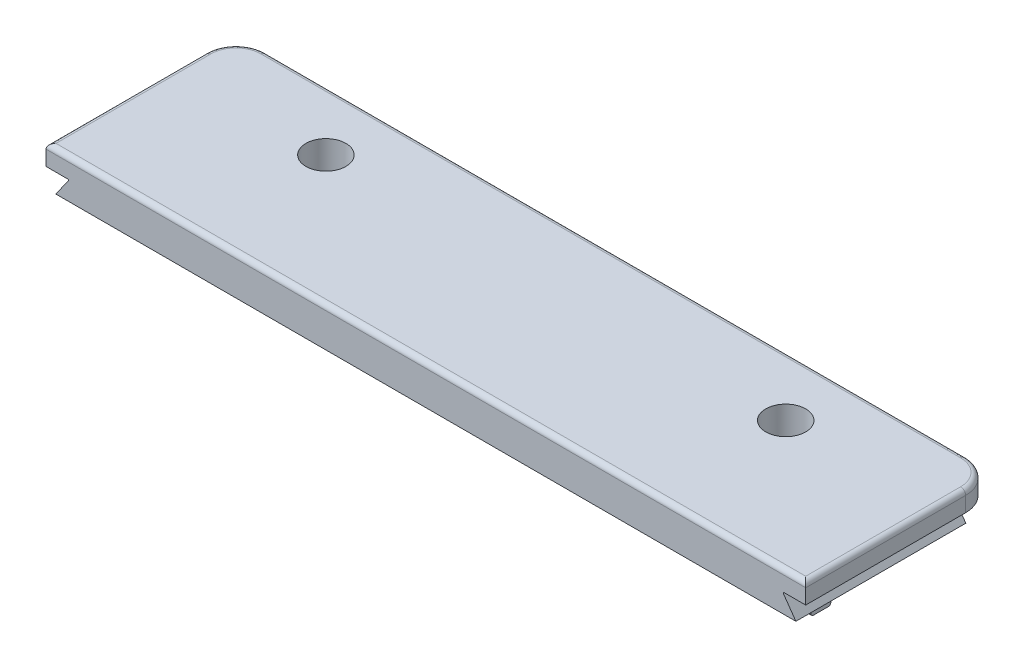
ISO-10303-21;
HEADER;
FILE_DESCRIPTION(('STEP AP214'),'2;1');
FILE_NAME('part.step','',(''),(''),'','','');
FILE_SCHEMA(('AUTOMOTIVE_DESIGN { 1 0 10303 214 1 1 1 1 }'));
ENDSEC;
DATA;
#1=APPLICATION_CONTEXT('core data for automotive mechanical design processes');
#2=APPLICATION_PROTOCOL_DEFINITION('international standard','automotive_design',2000,#1);
#3=PRODUCT_CONTEXT('',#1,'mechanical');
#4=PRODUCT('Part','Part','',(#3));
#5=PRODUCT_RELATED_PRODUCT_CATEGORY('part','',(#4));
#6=PRODUCT_DEFINITION_FORMATION('','',#4);
#7=PRODUCT_DEFINITION_CONTEXT('part definition',#1,'design');
#8=PRODUCT_DEFINITION('design','',#6,#7);
#9=PRODUCT_DEFINITION_SHAPE('','',#8);
#10=(LENGTH_UNIT() NAMED_UNIT(*) SI_UNIT(.MILLI.,.METRE.));
#11=(NAMED_UNIT(*) PLANE_ANGLE_UNIT() SI_UNIT($,.RADIAN.));
#12=(NAMED_UNIT(*) SI_UNIT($,.STERADIAN.) SOLID_ANGLE_UNIT());
#13=UNCERTAINTY_MEASURE_WITH_UNIT(LENGTH_MEASURE(1.E-05),#10,'distance_accuracy_value','');
#14=(GEOMETRIC_REPRESENTATION_CONTEXT(3) GLOBAL_UNCERTAINTY_ASSIGNED_CONTEXT((#13)) GLOBAL_UNIT_ASSIGNED_CONTEXT((#10,
#11,#12)) REPRESENTATION_CONTEXT('',''));
#15=CARTESIAN_POINT('',(0.,0.,0.));
#16=DIRECTION('',(0.,0.,1.));
#17=DIRECTION('',(1.,0.,0.));
#18=AXIS2_PLACEMENT_3D('',#15,#16,#17);
#19=CARTESIAN_POINT('',(37.0162186510252,22.2,-93.1));
#20=DIRECTION('',(0.,1.,0.));
#21=DIRECTION('',(-1.,0.,0.));
#22=AXIS2_PLACEMENT_3D('',#19,#20,#21);
#23=PLANE('',#22);
#24=CARTESIAN_POINT('',(23.,22.2,-13.));
#25=DIRECTION('',(0.,1.,0.));
#26=DIRECTION('',(-1.,0.,0.));
#27=AXIS2_PLACEMENT_3D('',#24,#25,#26);
#28=CIRCLE('',#27,2.);
#29=CARTESIAN_POINT('',(21.,22.2,-13.));
#30=VERTEX_POINT('',#29);
#31=EDGE_CURVE('E242',#30,#30,#28,.F.);
#32=ORIENTED_EDGE('',*,*,#31,.F.);
#33=EDGE_LOOP('',(#32));
#34=FACE_BOUND('',#33,.T.);
#35=CARTESIAN_POINT('',(-23.,22.2,-13.));
#36=DIRECTION('',(0.,1.,0.));
#37=DIRECTION('',(-1.,0.,0.));
#38=AXIS2_PLACEMENT_3D('',#35,#36,#37);
#39=CIRCLE('',#38,2.);
#40=CARTESIAN_POINT('',(-25.,22.2,-13.));
#41=VERTEX_POINT('',#40);
#42=EDGE_CURVE('E247',#41,#41,#39,.F.);
#43=ORIENTED_EDGE('',*,*,#42,.F.);
#44=EDGE_LOOP('',(#43));
#45=FACE_BOUND('',#44,.T.);
#46=DIRECTION('',(1.,0.,0.));
#47=VECTOR('',#46,1.);
#48=CARTESIAN_POINT('',(37.0162186510252,22.2,-3.5));
#49=LINE('',#48,#47);
#50=CARTESIAN_POINT('',(-37.0162186510252,22.2,-3.5));
#51=VERTEX_POINT('',#50);
#52=CARTESIAN_POINT('',(37.0162186510252,22.2,-3.5));
#53=VERTEX_POINT('',#52);
#54=EDGE_CURVE('E208',#51,#53,#49,.T.);
#55=ORIENTED_EDGE('',*,*,#54,.F.);
#56=DIRECTION('',(0.,0.,1.));
#57=VECTOR('',#56,1.);
#58=CARTESIAN_POINT('',(-37.0162186510252,22.2,-93.1));
#59=LINE('',#58,#57);
#60=CARTESIAN_POINT('',(-37.0162186510252,22.2,-17.));
#61=VERTEX_POINT('',#60);
#62=EDGE_CURVE('E206',#61,#51,#59,.T.);
#63=ORIENTED_EDGE('',*,*,#62,.F.);
#64=DIRECTION('',(-1.,0.,0.));
#65=VECTOR('',#64,1.);
#66=CARTESIAN_POINT('',(37.0162186510252,22.2,-17.));
#67=LINE('',#66,#65);
#68=CARTESIAN_POINT('',(37.0162186510252,22.2,-17.));
#69=VERTEX_POINT('',#68);
#70=EDGE_CURVE('E318',#69,#61,#67,.T.);
#71=ORIENTED_EDGE('',*,*,#70,.F.);
#72=DIRECTION('',(0.,0.,1.));
#73=VECTOR('',#72,1.);
#74=CARTESIAN_POINT('',(37.0162186510252,22.2,-93.1));
#75=LINE('',#74,#73);
#76=EDGE_CURVE('E287',#69,#53,#75,.T.);
#77=ORIENTED_EDGE('',*,*,#76,.T.);
#78=EDGE_LOOP('',(#55,#63,#71,#77));
#79=FACE_BOUND('',#78,.T.);
#80=ADVANCED_FACE('F45',(#34,#45,#79),#23,.F.);
#81=DIRECTION('',(-1.,0.,0.));
#82=VECTOR('',#81,1.);
#83=CARTESIAN_POINT('',(37.0162186510252,22.2,-1.5));
#84=LINE('',#83,#82);
#85=CARTESIAN_POINT('',(37.0162186510252,22.2,-1.5));
#86=VERTEX_POINT('',#85);
#87=CARTESIAN_POINT('',(-37.0162186510252,22.2,-1.50000000000001));
#88=VERTEX_POINT('',#87);
#89=EDGE_CURVE('E209',#86,#88,#84,.T.);
#90=ORIENTED_EDGE('',*,*,#89,.F.);
#91=CARTESIAN_POINT('',(37.0162186510252,22.2,0.));
#92=VERTEX_POINT('',#91);
#93=EDGE_CURVE('E292',#86,#92,#75,.T.);
#94=ORIENTED_EDGE('',*,*,#93,.T.);
#95=DIRECTION('',(-1.,0.,0.));
#96=VECTOR('',#95,1.);
#97=CARTESIAN_POINT('',(37.0162186510252,22.2,0.));
#98=LINE('',#97,#96);
#99=CARTESIAN_POINT('',(-37.0162186510252,22.2,0.));
#100=VERTEX_POINT('',#99);
#101=EDGE_CURVE('E216',#92,#100,#98,.T.);
#102=ORIENTED_EDGE('',*,*,#101,.T.);
#103=EDGE_CURVE('E203',#88,#100,#59,.T.);
#104=ORIENTED_EDGE('',*,*,#103,.F.);
#105=EDGE_LOOP('',(#90,#94,#102,#104));
#106=FACE_BOUND('',#105,.T.);
#107=ADVANCED_FACE('F213',(#106),#23,.F.);
#108=CARTESIAN_POINT('',(-38.,24.1,-93.1));
#109=DIRECTION('',(1.,0.,0.));
#110=DIRECTION('',(0.,1.,0.));
#111=AXIS2_PLACEMENT_3D('',#108,#109,#110);
#112=PLANE('',#111);
#113=DIRECTION('',(0.,1.,0.));
#114=VECTOR('',#113,1.);
#115=CARTESIAN_POINT('',(-38.,24.1,0.));
#116=LINE('',#115,#114);
#117=CARTESIAN_POINT('',(-38.,24.1,0.));
#118=VERTEX_POINT('',#117);
#119=CARTESIAN_POINT('',(-38.,25.6,0.));
#120=VERTEX_POINT('',#119);
#121=EDGE_CURVE('E306',#118,#120,#116,.T.);
#122=ORIENTED_EDGE('',*,*,#121,.T.);
#123=DIRECTION('',(0.,0.,1.));
#124=VECTOR('',#123,1.);
#125=CARTESIAN_POINT('',(-38.,25.6,-93.1));
#126=LINE('',#125,#124);
#127=CARTESIAN_POINT('',(-38.,25.6,-16.));
#128=VERTEX_POINT('',#127);
#129=EDGE_CURVE('E394',#120,#128,#126,.F.);
#130=ORIENTED_EDGE('',*,*,#129,.T.);
#131=DIRECTION('',(0.,1.,0.));
#132=VECTOR('',#131,1.);
#133=CARTESIAN_POINT('',(-38.,24.1,-16.));
#134=LINE('',#133,#132);
#135=CARTESIAN_POINT('',(-38.,24.1,-16.));
#136=VERTEX_POINT('',#135);
#137=EDGE_CURVE('E352',#128,#136,#134,.F.);
#138=ORIENTED_EDGE('',*,*,#137,.T.);
#139=DIRECTION('',(0.,0.,1.));
#140=VECTOR('',#139,1.);
#141=CARTESIAN_POINT('',(-38.,24.1,-93.1));
#142=LINE('',#141,#140);
#143=EDGE_CURVE('E269',#136,#118,#142,.T.);
#144=ORIENTED_EDGE('',*,*,#143,.T.);
#145=EDGE_LOOP('',(#122,#130,#138,#144));
#146=FACE_BOUND('',#145,.T.);
#147=ADVANCED_FACE('F491',(#146),#112,.F.);
#148=CARTESIAN_POINT('',(-38.,26.1,-93.1));
#149=DIRECTION('',(0.,-1.,0.));
#150=DIRECTION('',(0.,0.,-1.));
#151=AXIS2_PLACEMENT_3D('',#148,#149,#150);
#152=PLANE('',#151);
#153=CARTESIAN_POINT('',(-23.,26.1,-13.));
#154=DIRECTION('',(0.,1.,0.));
#155=DIRECTION('',(0.,0.,1.));
#156=AXIS2_PLACEMENT_3D('',#153,#154,#155);
#157=CIRCLE('',#156,2.);
#158=CARTESIAN_POINT('',(-23.,26.1,-11.));
#159=VERTEX_POINT('',#158);
#160=EDGE_CURVE('E243',#159,#159,#157,.T.);
#161=ORIENTED_EDGE('',*,*,#160,.F.);
#162=EDGE_LOOP('',(#161));
#163=FACE_BOUND('',#162,.T.);
#164=CARTESIAN_POINT('',(23.,26.1,-13.));
#165=DIRECTION('',(0.,1.,0.));
#166=DIRECTION('',(0.,0.,-1.));
#167=AXIS2_PLACEMENT_3D('',#164,#165,#166);
#168=CIRCLE('',#167,2.);
#169=CARTESIAN_POINT('',(23.,26.1,-15.));
#170=VERTEX_POINT('',#169);
#171=EDGE_CURVE('E248',#170,#170,#168,.T.);
#172=ORIENTED_EDGE('',*,*,#171,.F.);
#173=EDGE_LOOP('',(#172));
#174=FACE_BOUND('',#173,.T.);
#175=DIRECTION('',(0.,0.,1.));
#176=VECTOR('',#175,1.);
#177=CARTESIAN_POINT('',(37.5,26.1,-16.));
#178=LINE('',#177,#176);
#179=CARTESIAN_POINT('',(37.5,26.1,-0.5));
#180=VERTEX_POINT('',#179);
#181=CARTESIAN_POINT('',(37.5,26.1,-16.));
#182=VERTEX_POINT('',#181);
#183=EDGE_CURVE('E377',#180,#182,#178,.F.);
#184=ORIENTED_EDGE('',*,*,#183,.T.);
#185=CARTESIAN_POINT('',(35.,26.1,-16.));
#186=DIRECTION('',(0.,-1.,0.));
#187=DIRECTION('',(0.,0.,-1.));
#188=AXIS2_PLACEMENT_3D('',#185,#186,#187);
#189=CIRCLE('',#188,2.5);
#190=CARTESIAN_POINT('',(35.,26.1,-18.5));
#191=VERTEX_POINT('',#190);
#192=EDGE_CURVE('E380',#182,#191,#189,.F.);
#193=ORIENTED_EDGE('',*,*,#192,.T.);
#194=DIRECTION('',(1.,0.,0.));
#195=VECTOR('',#194,1.);
#196=CARTESIAN_POINT('',(-35.,26.1,-18.5));
#197=LINE('',#196,#195);
#198=CARTESIAN_POINT('',(-35.,26.1,-18.5));
#199=VERTEX_POINT('',#198);
#200=EDGE_CURVE('E365',#191,#199,#197,.F.);
#201=ORIENTED_EDGE('',*,*,#200,.T.);
#202=CARTESIAN_POINT('',(-35.,26.1,-16.));
#203=DIRECTION('',(0.,-1.,0.));
#204=DIRECTION('',(0.,0.,-1.));
#205=AXIS2_PLACEMENT_3D('',#202,#203,#204);
#206=CIRCLE('',#205,2.5);
#207=CARTESIAN_POINT('',(-37.5,26.1,-16.));
#208=VERTEX_POINT('',#207);
#209=EDGE_CURVE('E368',#199,#208,#206,.F.);
#210=ORIENTED_EDGE('',*,*,#209,.T.);
#211=DIRECTION('',(0.,0.,1.));
#212=VECTOR('',#211,1.);
#213=CARTESIAN_POINT('',(-37.5,26.1,-93.1));
#214=LINE('',#213,#212);
#215=CARTESIAN_POINT('',(-37.5,26.1,-0.5));
#216=VERTEX_POINT('',#215);
#217=EDGE_CURVE('E371',#208,#216,#214,.T.);
#218=ORIENTED_EDGE('',*,*,#217,.T.);
#219=DIRECTION('',(1.,0.,0.));
#220=VECTOR('',#219,1.);
#221=CARTESIAN_POINT('',(-38.,26.1,-0.5));
#222=LINE('',#221,#220);
#223=EDGE_CURVE('E374',#216,#180,#222,.T.);
#224=ORIENTED_EDGE('',*,*,#223,.T.);
#225=EDGE_LOOP('',(#184,#193,#201,#210,#218,#224));
#226=FACE_BOUND('',#225,.T.);
#227=ADVANCED_FACE('F506',(#163,#174,#226),#152,.F.);
#228=CARTESIAN_POINT('',(38.,24.1,-93.1));
#229=DIRECTION('',(1.,0.,0.));
#230=DIRECTION('',(0.,1.,0.));
#231=AXIS2_PLACEMENT_3D('',#228,#229,#230);
#232=PLANE('',#231);
#233=DIRECTION('',(0.,-1.,0.));
#234=VECTOR('',#233,1.);
#235=CARTESIAN_POINT('',(38.,24.1,-16.));
#236=LINE('',#235,#234);
#237=CARTESIAN_POINT('',(38.,24.1,-16.));
#238=VERTEX_POINT('',#237);
#239=CARTESIAN_POINT('',(38.,25.6,-16.));
#240=VERTEX_POINT('',#239);
#241=EDGE_CURVE('E361',#238,#240,#236,.F.);
#242=ORIENTED_EDGE('',*,*,#241,.T.);
#243=DIRECTION('',(0.,0.,1.));
#244=VECTOR('',#243,1.);
#245=CARTESIAN_POINT('',(38.,25.6,0.));
#246=LINE('',#245,#244);
#247=CARTESIAN_POINT('',(38.,25.6,0.));
#248=VERTEX_POINT('',#247);
#249=EDGE_CURVE('E388',#240,#248,#246,.T.);
#250=ORIENTED_EDGE('',*,*,#249,.T.);
#251=DIRECTION('',(0.,1.,0.));
#252=VECTOR('',#251,1.);
#253=CARTESIAN_POINT('',(38.,24.1,0.));
#254=LINE('',#253,#252);
#255=CARTESIAN_POINT('',(38.,24.1,0.));
#256=VERTEX_POINT('',#255);
#257=EDGE_CURVE('E301',#256,#248,#254,.T.);
#258=ORIENTED_EDGE('',*,*,#257,.F.);
#259=DIRECTION('',(0.,0.,1.));
#260=VECTOR('',#259,1.);
#261=CARTESIAN_POINT('',(38.,24.1,-93.1));
#262=LINE('',#261,#260);
#263=EDGE_CURVE('E310',#238,#256,#262,.T.);
#264=ORIENTED_EDGE('',*,*,#263,.F.);
#265=EDGE_LOOP('',(#242,#250,#258,#264));
#266=FACE_BOUND('',#265,.T.);
#267=ADVANCED_FACE('F503',(#266),#232,.T.);
#268=CARTESIAN_POINT('',(35.7558450822477,24.1,-93.1));
#269=DIRECTION('',(0.,-1.,0.));
#270=DIRECTION('',(0.,0.,-1.));
#271=AXIS2_PLACEMENT_3D('',#268,#269,#270);
#272=PLANE('',#271);
#273=ORIENTED_EDGE('',*,*,#143,.F.);
#274=CARTESIAN_POINT('',(-35.,24.1,-16.));
#275=DIRECTION('',(0.,-1.,0.));
#276=DIRECTION('',(0.,0.,-1.));
#277=AXIS2_PLACEMENT_3D('',#274,#275,#276);
#278=CIRCLE('',#277,3.);
#279=CARTESIAN_POINT('',(-35.,24.1,-19.));
#280=VERTEX_POINT('',#279);
#281=EDGE_CURVE('E358',#136,#280,#278,.T.);
#282=ORIENTED_EDGE('',*,*,#281,.T.);
#283=DIRECTION('',(-1.,0.,0.));
#284=VECTOR('',#283,1.);
#285=CARTESIAN_POINT('',(38.,24.1,-19.));
#286=LINE('',#285,#284);
#287=CARTESIAN_POINT('',(35.,24.1,-19.));
#288=VERTEX_POINT('',#287);
#289=EDGE_CURVE('E265',#288,#280,#286,.T.);
#290=ORIENTED_EDGE('',*,*,#289,.F.);
#291=CARTESIAN_POINT('',(35.,24.1,-16.));
#292=DIRECTION('',(0.,-1.,0.));
#293=DIRECTION('',(0.,0.,-1.));
#294=AXIS2_PLACEMENT_3D('',#291,#292,#293);
#295=CIRCLE('',#294,3.);
#296=EDGE_CURVE('E355',#288,#238,#295,.T.);
#297=ORIENTED_EDGE('',*,*,#296,.T.);
#298=ORIENTED_EDGE('',*,*,#263,.T.);
#299=DIRECTION('',(1.,0.,0.));
#300=VECTOR('',#299,1.);
#301=CARTESIAN_POINT('',(35.7558450822477,24.1,0.));
#302=LINE('',#301,#300);
#303=CARTESIAN_POINT('',(35.7558450822477,24.1,0.));
#304=VERTEX_POINT('',#303);
#305=EDGE_CURVE('E297',#304,#256,#302,.T.);
#306=ORIENTED_EDGE('',*,*,#305,.F.);
#307=DIRECTION('',(0.,0.,1.));
#308=VECTOR('',#307,1.);
#309=CARTESIAN_POINT('',(35.7558450822477,24.1,-93.1));
#310=LINE('',#309,#308);
#311=CARTESIAN_POINT('',(35.7558450822477,24.1,-17.));
#312=VERTEX_POINT('',#311);
#313=EDGE_CURVE('E329',#312,#304,#310,.T.);
#314=ORIENTED_EDGE('',*,*,#313,.F.);
#315=DIRECTION('',(-1.,0.,0.));
#316=VECTOR('',#315,1.);
#317=CARTESIAN_POINT('',(38.,24.1,-17.));
#318=LINE('',#317,#316);
#319=CARTESIAN_POINT('',(-35.7558450822477,24.1,-17.));
#320=VERTEX_POINT('',#319);
#321=EDGE_CURVE('E259',#312,#320,#318,.T.);
#322=ORIENTED_EDGE('',*,*,#321,.T.);
#323=DIRECTION('',(0.,0.,1.));
#324=VECTOR('',#323,1.);
#325=CARTESIAN_POINT('',(-35.7558450822477,24.1,-93.1));
#326=LINE('',#325,#324);
#327=CARTESIAN_POINT('',(-35.7558450822477,24.1,0.));
#328=VERTEX_POINT('',#327);
#329=EDGE_CURVE('E276',#320,#328,#326,.T.);
#330=ORIENTED_EDGE('',*,*,#329,.T.);
#331=DIRECTION('',(-1.,0.,0.));
#332=VECTOR('',#331,1.);
#333=CARTESIAN_POINT('',(-35.7558450822477,24.1,0.));
#334=LINE('',#333,#332);
#335=EDGE_CURVE('E271',#328,#118,#334,.T.);
#336=ORIENTED_EDGE('',*,*,#335,.T.);
#337=EDGE_LOOP('',(#273,#282,#290,#297,#298,#306,#314,#322,#330,#336));
#338=FACE_BOUND('',#337,.T.);
#339=ADVANCED_FACE('F472',(#338),#272,.T.);
#340=CARTESIAN_POINT('',(35.7558450822477,24.,-93.1));
#341=DIRECTION('',(1.,0.,0.));
#342=DIRECTION('',(0.,1.,0.));
#343=AXIS2_PLACEMENT_3D('',#340,#341,#342);
#344=PLANE('',#343);
#345=DIRECTION('',(0.,0.,1.));
#346=VECTOR('',#345,1.);
#347=CARTESIAN_POINT('',(35.7558450822477,24.,-93.1));
#348=LINE('',#347,#346);
#349=CARTESIAN_POINT('',(35.7558450822477,24.,-17.));
#350=VERTEX_POINT('',#349);
#351=CARTESIAN_POINT('',(35.7558450822477,24.,0.));
#352=VERTEX_POINT('',#351);
#353=EDGE_CURVE('E293',#350,#352,#348,.T.);
#354=ORIENTED_EDGE('',*,*,#353,.F.);
#355=DIRECTION('',(0.,1.,0.));
#356=VECTOR('',#355,1.);
#357=CARTESIAN_POINT('',(35.7558450822477,24.,-17.));
#358=LINE('',#357,#356);
#359=EDGE_CURVE('E325',#350,#312,#358,.T.);
#360=ORIENTED_EDGE('',*,*,#359,.T.);
#361=ORIENTED_EDGE('',*,*,#313,.T.);
#362=DIRECTION('',(0.,1.,0.));
#363=VECTOR('',#362,1.);
#364=CARTESIAN_POINT('',(35.7558450822477,24.,0.));
#365=LINE('',#364,#363);
#366=EDGE_CURVE('E275',#352,#304,#365,.T.);
#367=ORIENTED_EDGE('',*,*,#366,.F.);
#368=EDGE_LOOP('',(#354,#360,#361,#367));
#369=FACE_BOUND('',#368,.T.);
#370=ADVANCED_FACE('F467',(#369),#344,.T.);
#371=CARTESIAN_POINT('',(35.7558450822477,24.,-93.1));
#372=DIRECTION('',(-0.819152044288991,-0.573576436351048,0.));
#373=DIRECTION('',(0.573576436351048,-0.819152044288991,0.));
#374=AXIS2_PLACEMENT_3D('',#371,#372,#373);
#375=PLANE('',#374);
#376=DIRECTION('',(0.573576436351048,-0.819152044288991,0.));
#377=VECTOR('',#376,1.);
#378=CARTESIAN_POINT('',(35.7558450822477,24.,-17.));
#379=LINE('',#378,#377);
#380=EDGE_CURVE('E305',#350,#69,#379,.T.);
#381=ORIENTED_EDGE('',*,*,#380,.F.);
#382=ORIENTED_EDGE('',*,*,#353,.T.);
#383=DIRECTION('',(0.573576436351048,-0.819152044288991,0.));
#384=VECTOR('',#383,1.);
#385=CARTESIAN_POINT('',(35.7558450822477,24.,0.));
#386=LINE('',#385,#384);
#387=EDGE_CURVE('E288',#352,#92,#386,.T.);
#388=ORIENTED_EDGE('',*,*,#387,.T.);
#389=ORIENTED_EDGE('',*,*,#93,.F.);
#390=DIRECTION('',(0.,0.,1.));
#391=VECTOR('',#390,1.);
#392=CARTESIAN_POINT('',(37.0162186510252,22.2,-1.5));
#393=LINE('',#392,#391);
#394=EDGE_CURVE('E223',#53,#86,#393,.T.);
#395=ORIENTED_EDGE('',*,*,#394,.F.);
#396=ORIENTED_EDGE('',*,*,#76,.F.);
#397=EDGE_LOOP('',(#381,#382,#388,#389,#395,#396));
#398=FACE_BOUND('',#397,.T.);
#399=ADVANCED_FACE('F460',(#398),#375,.F.);
#400=CARTESIAN_POINT('',(-37.0162186510252,22.2,-93.1));
#401=DIRECTION('',(0.819152044288987,-0.573576436351053,0.));
#402=DIRECTION('',(0.573576436351054,0.819152044288987,0.));
#403=AXIS2_PLACEMENT_3D('',#400,#401,#402);
#404=PLANE('',#403);
#405=DIRECTION('',(0.573576436351054,0.819152044288987,0.));
#406=VECTOR('',#405,1.);
#407=CARTESIAN_POINT('',(-37.0162186510252,22.2,-17.));
#408=LINE('',#407,#406);
#409=CARTESIAN_POINT('',(-35.7558450822477,24.,-17.));
#410=VERTEX_POINT('',#409);
#411=EDGE_CURVE('E314',#61,#410,#408,.T.);
#412=ORIENTED_EDGE('',*,*,#411,.F.);
#413=ORIENTED_EDGE('',*,*,#62,.T.);
#414=DIRECTION('',(0.,0.,-1.));
#415=VECTOR('',#414,1.);
#416=CARTESIAN_POINT('',(-37.0162186510252,22.2,-1.50000000000001));
#417=LINE('',#416,#415);
#418=EDGE_CURVE('E190',#88,#51,#417,.T.);
#419=ORIENTED_EDGE('',*,*,#418,.F.);
#420=ORIENTED_EDGE('',*,*,#103,.T.);
#421=DIRECTION('',(0.573576436351053,0.819152044288987,0.));
#422=VECTOR('',#421,1.);
#423=CARTESIAN_POINT('',(-37.0162186510252,22.2,0.));
#424=LINE('',#423,#422);
#425=CARTESIAN_POINT('',(-35.7558450822477,24.,0.));
#426=VERTEX_POINT('',#425);
#427=EDGE_CURVE('E282',#100,#426,#424,.T.);
#428=ORIENTED_EDGE('',*,*,#427,.T.);
#429=DIRECTION('',(0.,0.,1.));
#430=VECTOR('',#429,1.);
#431=CARTESIAN_POINT('',(-35.7558450822477,24.,-93.1));
#432=LINE('',#431,#430);
#433=EDGE_CURVE('E281',#410,#426,#432,.T.);
#434=ORIENTED_EDGE('',*,*,#433,.F.);
#435=EDGE_LOOP('',(#412,#413,#419,#420,#428,#434));
#436=FACE_BOUND('',#435,.T.);
#437=ADVANCED_FACE('F201',(#436),#404,.F.);
#438=CARTESIAN_POINT('',(-35.7558450822477,24.,-93.1));
#439=DIRECTION('',(1.,0.,0.));
#440=DIRECTION('',(0.,1.,0.));
#441=AXIS2_PLACEMENT_3D('',#438,#439,#440);
#442=PLANE('',#441);
#443=DIRECTION('',(0.,1.,0.));
#444=VECTOR('',#443,1.);
#445=CARTESIAN_POINT('',(-35.7558450822477,24.,-17.));
#446=LINE('',#445,#444);
#447=EDGE_CURVE('E264',#410,#320,#446,.T.);
#448=ORIENTED_EDGE('',*,*,#447,.F.);
#449=ORIENTED_EDGE('',*,*,#433,.T.);
#450=DIRECTION('',(0.,1.,0.));
#451=VECTOR('',#450,1.);
#452=CARTESIAN_POINT('',(-35.7558450822477,24.,0.));
#453=LINE('',#452,#451);
#454=EDGE_CURVE('E277',#426,#328,#453,.T.);
#455=ORIENTED_EDGE('',*,*,#454,.T.);
#456=ORIENTED_EDGE('',*,*,#329,.F.);
#457=EDGE_LOOP('',(#448,#449,#455,#456));
#458=FACE_BOUND('',#457,.T.);
#459=ADVANCED_FACE('F582',(#458),#442,.F.);
#460=CARTESIAN_POINT('',(0.,0.,0.));
#461=DIRECTION('',(0.,0.,-1.));
#462=DIRECTION('',(-1.,0.,0.));
#463=AXIS2_PLACEMENT_3D('',#460,#461,#462);
#464=PLANE('',#463);
#465=ORIENTED_EDGE('',*,*,#257,.T.);
#466=DIRECTION('',(1.,0.,0.));
#467=VECTOR('',#466,1.);
#468=CARTESIAN_POINT('',(0.,25.6,0.));
#469=LINE('',#468,#467);
#470=EDGE_CURVE('E391',#248,#120,#469,.F.);
#471=ORIENTED_EDGE('',*,*,#470,.T.);
#472=ORIENTED_EDGE('',*,*,#121,.F.);
#473=ORIENTED_EDGE('',*,*,#335,.F.);
#474=ORIENTED_EDGE('',*,*,#454,.F.);
#475=ORIENTED_EDGE('',*,*,#427,.F.);
#476=ORIENTED_EDGE('',*,*,#101,.F.);
#477=ORIENTED_EDGE('',*,*,#387,.F.);
#478=ORIENTED_EDGE('',*,*,#366,.T.);
#479=ORIENTED_EDGE('',*,*,#305,.T.);
#480=EDGE_LOOP('',(#465,#471,#472,#473,#474,#475,#476,#477,#478,#479));
#481=FACE_BOUND('',#480,.T.);
#482=ADVANCED_FACE('F477',(#481),#464,.F.);
#483=CARTESIAN_POINT('',(0.,0.,-17.));
#484=DIRECTION('',(0.,0.,-1.));
#485=DIRECTION('',(-1.,0.,0.));
#486=AXIS2_PLACEMENT_3D('',#483,#484,#485);
#487=PLANE('',#486);
#488=ORIENTED_EDGE('',*,*,#321,.F.);
#489=ORIENTED_EDGE('',*,*,#359,.F.);
#490=ORIENTED_EDGE('',*,*,#380,.T.);
#491=ORIENTED_EDGE('',*,*,#70,.T.);
#492=ORIENTED_EDGE('',*,*,#411,.T.);
#493=ORIENTED_EDGE('',*,*,#447,.T.);
#494=EDGE_LOOP('',(#488,#489,#490,#491,#492,#493));
#495=FACE_BOUND('',#494,.T.);
#496=ADVANCED_FACE('F464',(#495),#487,.T.);
#497=CARTESIAN_POINT('',(0.,0.,-19.));
#498=DIRECTION('',(0.,0.,-1.));
#499=DIRECTION('',(-1.,0.,0.));
#500=AXIS2_PLACEMENT_3D('',#497,#498,#499);
#501=PLANE('',#500);
#502=DIRECTION('',(0.,1.,0.));
#503=VECTOR('',#502,1.);
#504=CARTESIAN_POINT('',(-35.,26.1,-19.));
#505=LINE('',#504,#503);
#506=CARTESIAN_POINT('',(-35.,25.6,-19.));
#507=VERTEX_POINT('',#506);
#508=EDGE_CURVE('E348',#280,#507,#505,.T.);
#509=ORIENTED_EDGE('',*,*,#508,.T.);
#510=DIRECTION('',(1.,0.,0.));
#511=VECTOR('',#510,1.);
#512=CARTESIAN_POINT('',(35.,25.6,-19.));
#513=LINE('',#512,#511);
#514=CARTESIAN_POINT('',(35.,25.6,-19.));
#515=VERTEX_POINT('',#514);
#516=EDGE_CURVE('E400',#507,#515,#513,.T.);
#517=ORIENTED_EDGE('',*,*,#516,.T.);
#518=DIRECTION('',(0.,-1.,0.));
#519=VECTOR('',#518,1.);
#520=CARTESIAN_POINT('',(35.0000000000001,1.21430643318377E-13,-19.));
#521=LINE('',#520,#519);
#522=EDGE_CURVE('E263',#515,#288,#521,.T.);
#523=ORIENTED_EDGE('',*,*,#522,.T.);
#524=ORIENTED_EDGE('',*,*,#289,.T.);
#525=EDGE_LOOP('',(#509,#517,#523,#524));
#526=FACE_BOUND('',#525,.T.);
#527=ADVANCED_FACE('F516',(#526),#501,.T.);
#528=CARTESIAN_POINT('',(-35.0000000000001,1.21430643318377E-13,-16.));
#529=DIRECTION('',(0.,-1.,0.));
#530=DIRECTION('',(1.,0.,0.));
#531=AXIS2_PLACEMENT_3D('',#528,#529,#530);
#532=CYLINDRICAL_SURFACE('',#531,3.);
#533=ORIENTED_EDGE('',*,*,#137,.F.);
#534=CARTESIAN_POINT('',(-35.,25.6,-16.));
#535=DIRECTION('',(0.,-1.,0.));
#536=DIRECTION('',(0.,0.,-1.));
#537=AXIS2_PLACEMENT_3D('',#534,#535,#536);
#538=CIRCLE('',#537,3.);
#539=EDGE_CURVE('E397',#128,#507,#538,.T.);
#540=ORIENTED_EDGE('',*,*,#539,.T.);
#541=ORIENTED_EDGE('',*,*,#508,.F.);
#542=ORIENTED_EDGE('',*,*,#281,.F.);
#543=EDGE_LOOP('',(#533,#540,#541,#542));
#544=FACE_BOUND('',#543,.T.);
#545=ADVANCED_FACE('F517',(#544),#532,.T.);
#546=CARTESIAN_POINT('',(35.0000000000001,1.21430643318377E-13,-16.));
#547=DIRECTION('',(0.,-1.,0.));
#548=DIRECTION('',(1.,0.,0.));
#549=AXIS2_PLACEMENT_3D('',#546,#547,#548);
#550=CYLINDRICAL_SURFACE('',#549,3.);
#551=ORIENTED_EDGE('',*,*,#522,.F.);
#552=CARTESIAN_POINT('',(35.,25.6,-16.));
#553=DIRECTION('',(0.,-1.,0.));
#554=DIRECTION('',(0.,0.,-1.));
#555=AXIS2_PLACEMENT_3D('',#552,#553,#554);
#556=CIRCLE('',#555,3.);
#557=EDGE_CURVE('E384',#515,#240,#556,.T.);
#558=ORIENTED_EDGE('',*,*,#557,.T.);
#559=ORIENTED_EDGE('',*,*,#241,.F.);
#560=ORIENTED_EDGE('',*,*,#296,.F.);
#561=EDGE_LOOP('',(#551,#558,#559,#560));
#562=FACE_BOUND('',#561,.T.);
#563=ADVANCED_FACE('F520',(#562),#550,.T.);
#564=CARTESIAN_POINT('',(-37.5,25.6,-93.1));
#565=DIRECTION('',(0.,0.,1.));
#566=DIRECTION('',(1.,0.,0.));
#567=AXIS2_PLACEMENT_3D('',#564,#565,#566);
#568=CYLINDRICAL_SURFACE('',#567,0.5);
#569=CARTESIAN_POINT('',(-37.5,25.6,-16.));
#570=DIRECTION('',(0.,0.,-1.));
#571=DIRECTION('',(-1.,0.,0.));
#572=AXIS2_PLACEMENT_3D('',#569,#570,#571);
#573=CIRCLE('',#572,0.5);
#574=EDGE_CURVE('E417',#128,#208,#573,.T.);
#575=ORIENTED_EDGE('',*,*,#574,.F.);
#576=ORIENTED_EDGE('',*,*,#129,.F.);
#577=CARTESIAN_POINT('',(-37.5,25.6,-0.5));
#578=DIRECTION('',(0.707106781186547,0.,0.707106781186547));
#579=DIRECTION('',(-0.707106781186547,0.,0.707106781186547));
#580=AXIS2_PLACEMENT_3D('',#577,#578,#579);
#581=ELLIPSE('',#580,0.707106781186547,0.5);
#582=EDGE_CURVE('E270',#216,#120,#581,.T.);
#583=ORIENTED_EDGE('',*,*,#582,.F.);
#584=ORIENTED_EDGE('',*,*,#217,.F.);
#585=EDGE_LOOP('',(#575,#576,#583,#584));
#586=FACE_BOUND('',#585,.T.);
#587=ADVANCED_FACE('F524',(#586),#568,.T.);
#588=CARTESIAN_POINT('',(-38.,25.6,-0.5));
#589=DIRECTION('',(1.,0.,0.));
#590=DIRECTION('',(0.,0.,-1.));
#591=AXIS2_PLACEMENT_3D('',#588,#589,#590);
#592=CYLINDRICAL_SURFACE('',#591,0.5);
#593=ORIENTED_EDGE('',*,*,#582,.T.);
#594=ORIENTED_EDGE('',*,*,#470,.F.);
#595=CARTESIAN_POINT('',(37.5,25.6,-0.5));
#596=DIRECTION('',(0.707106781186547,0.,-0.707106781186547));
#597=DIRECTION('',(0.707106781186547,0.,0.707106781186547));
#598=AXIS2_PLACEMENT_3D('',#595,#596,#597);
#599=ELLIPSE('',#598,0.707106781186547,0.5);
#600=EDGE_CURVE('E413',#180,#248,#599,.T.);
#601=ORIENTED_EDGE('',*,*,#600,.F.);
#602=ORIENTED_EDGE('',*,*,#223,.F.);
#603=EDGE_LOOP('',(#593,#594,#601,#602));
#604=FACE_BOUND('',#603,.T.);
#605=ADVANCED_FACE('F542',(#604),#592,.T.);
#606=CARTESIAN_POINT('',(-35.,25.6,-16.));
#607=DIRECTION('',(0.,-1.,0.));
#608=DIRECTION('',(0.,0.,-1.));
#609=AXIS2_PLACEMENT_3D('',#606,#607,#608);
#610=TOROIDAL_SURFACE('',#609,2.5,0.5);
#611=ORIENTED_EDGE('',*,*,#574,.T.);
#612=ORIENTED_EDGE('',*,*,#209,.F.);
#613=CARTESIAN_POINT('',(-35.,25.6,-18.5));
#614=DIRECTION('',(1.,0.,0.));
#615=DIRECTION('',(0.,0.,-1.));
#616=AXIS2_PLACEMENT_3D('',#613,#614,#615);
#617=CIRCLE('',#616,0.5);
#618=EDGE_CURVE('E409',#507,#199,#617,.T.);
#619=ORIENTED_EDGE('',*,*,#618,.F.);
#620=ORIENTED_EDGE('',*,*,#539,.F.);
#621=EDGE_LOOP('',(#611,#612,#619,#620));
#622=FACE_BOUND('',#621,.T.);
#623=ADVANCED_FACE('F538',(#622),#610,.T.);
#624=CARTESIAN_POINT('',(37.5,25.6,-93.1));
#625=DIRECTION('',(0.,0.,-1.));
#626=DIRECTION('',(-1.,0.,0.));
#627=AXIS2_PLACEMENT_3D('',#624,#625,#626);
#628=CYLINDRICAL_SURFACE('',#627,0.5);
#629=ORIENTED_EDGE('',*,*,#600,.T.);
#630=ORIENTED_EDGE('',*,*,#249,.F.);
#631=CARTESIAN_POINT('',(37.5,25.6,-16.));
#632=DIRECTION('',(0.,0.,-1.));
#633=DIRECTION('',(-1.,0.,0.));
#634=AXIS2_PLACEMENT_3D('',#631,#632,#633);
#635=CIRCLE('',#634,0.5);
#636=EDGE_CURVE('E406',#182,#240,#635,.T.);
#637=ORIENTED_EDGE('',*,*,#636,.F.);
#638=ORIENTED_EDGE('',*,*,#183,.F.);
#639=EDGE_LOOP('',(#629,#630,#637,#638));
#640=FACE_BOUND('',#639,.T.);
#641=ADVANCED_FACE('F534',(#640),#628,.T.);
#642=CARTESIAN_POINT('',(0.,25.6,-18.5));
#643=DIRECTION('',(-1.,0.,0.));
#644=DIRECTION('',(0.,0.,1.));
#645=AXIS2_PLACEMENT_3D('',#642,#643,#644);
#646=CYLINDRICAL_SURFACE('',#645,0.5);
#647=ORIENTED_EDGE('',*,*,#618,.T.);
#648=ORIENTED_EDGE('',*,*,#200,.F.);
#649=CARTESIAN_POINT('',(35.,25.6,-18.5));
#650=DIRECTION('',(1.,0.,0.));
#651=DIRECTION('',(0.,0.,-1.));
#652=AXIS2_PLACEMENT_3D('',#649,#650,#651);
#653=CIRCLE('',#652,0.5);
#654=EDGE_CURVE('E252',#515,#191,#653,.T.);
#655=ORIENTED_EDGE('',*,*,#654,.F.);
#656=ORIENTED_EDGE('',*,*,#516,.F.);
#657=EDGE_LOOP('',(#647,#648,#655,#656));
#658=FACE_BOUND('',#657,.T.);
#659=ADVANCED_FACE('F530',(#658),#646,.T.);
#660=CARTESIAN_POINT('',(35.,25.6,-16.));
#661=DIRECTION('',(0.,-1.,0.));
#662=DIRECTION('',(0.,0.,-1.));
#663=AXIS2_PLACEMENT_3D('',#660,#661,#662);
#664=TOROIDAL_SURFACE('',#663,2.5,0.5);
#665=ORIENTED_EDGE('',*,*,#636,.T.);
#666=ORIENTED_EDGE('',*,*,#557,.F.);
#667=ORIENTED_EDGE('',*,*,#654,.T.);
#668=ORIENTED_EDGE('',*,*,#192,.F.);
#669=EDGE_LOOP('',(#665,#666,#667,#668));
#670=FACE_BOUND('',#669,.T.);
#671=ADVANCED_FACE('F526',(#670),#664,.T.);
#672=CARTESIAN_POINT('',(23.,22.199,-13.));
#673=DIRECTION('',(0.,1.,0.));
#674=DIRECTION('',(0.,0.,1.));
#675=AXIS2_PLACEMENT_3D('',#672,#673,#674);
#676=CYLINDRICAL_SURFACE('',#675,2.);
#677=ORIENTED_EDGE('',*,*,#171,.T.);
#678=EDGE_LOOP('',(#677));
#679=FACE_BOUND('',#678,.T.);
#680=ORIENTED_EDGE('',*,*,#31,.T.);
#681=EDGE_LOOP('',(#680));
#682=FACE_BOUND('',#681,.T.);
#683=ADVANCED_FACE('F529',(#679,#682),#676,.F.);
#684=CARTESIAN_POINT('',(-23.,22.199,-13.));
#685=DIRECTION('',(0.,1.,0.));
#686=DIRECTION('',(0.,0.,1.));
#687=AXIS2_PLACEMENT_3D('',#684,#685,#686);
#688=CYLINDRICAL_SURFACE('',#687,2.);
#689=ORIENTED_EDGE('',*,*,#160,.T.);
#690=EDGE_LOOP('',(#689));
#691=FACE_BOUND('',#690,.T.);
#692=ORIENTED_EDGE('',*,*,#42,.T.);
#693=EDGE_LOOP('',(#692));
#694=FACE_BOUND('',#693,.T.);
#695=ADVANCED_FACE('F595',(#691,#694),#688,.F.);
#696=CARTESIAN_POINT('',(37.0162186510252,21.85,-1.5));
#697=DIRECTION('',(-1.,0.,0.));
#698=DIRECTION('',(0.,0.,1.));
#699=AXIS2_PLACEMENT_3D('',#696,#697,#698);
#700=PLANE('',#699);
#701=DIRECTION('',(0.,0.,1.));
#702=VECTOR('',#701,1.);
#703=CARTESIAN_POINT('',(37.0162186510252,21.85,-1.5));
#704=LINE('',#703,#702);
#705=CARTESIAN_POINT('',(37.0162186510252,21.85,-3.25));
#706=VERTEX_POINT('',#705);
#707=CARTESIAN_POINT('',(37.0162186510252,21.85,-1.75));
#708=VERTEX_POINT('',#707);
#709=EDGE_CURVE('E233',#706,#708,#704,.T.);
#710=ORIENTED_EDGE('',*,*,#709,.F.);
#711=CARTESIAN_POINT('',(37.0162186510252,22.1,-3.25));
#712=DIRECTION('',(-1.,0.,0.));
#713=DIRECTION('',(0.,0.,1.));
#714=AXIS2_PLACEMENT_3D('',#711,#712,#713);
#715=CIRCLE('',#714,0.25);
#716=CARTESIAN_POINT('',(37.0162186510252,22.1,-3.5));
#717=VERTEX_POINT('',#716);
#718=EDGE_CURVE('E434',#706,#717,#715,.F.);
#719=ORIENTED_EDGE('',*,*,#718,.T.);
#720=DIRECTION('',(0.,1.,0.));
#721=VECTOR('',#720,1.);
#722=CARTESIAN_POINT('',(37.0162186510252,21.85,-3.5));
#723=LINE('',#722,#721);
#724=EDGE_CURVE('E234',#717,#53,#723,.T.);
#725=ORIENTED_EDGE('',*,*,#724,.T.);
#726=ORIENTED_EDGE('',*,*,#394,.T.);
#727=DIRECTION('',(0.,1.,0.));
#728=VECTOR('',#727,1.);
#729=CARTESIAN_POINT('',(37.0162186510252,21.85,-1.5));
#730=LINE('',#729,#728);
#731=CARTESIAN_POINT('',(37.0162186510252,22.1,-1.5));
#732=VERTEX_POINT('',#731);
#733=EDGE_CURVE('E195',#732,#86,#730,.T.);
#734=ORIENTED_EDGE('',*,*,#733,.F.);
#735=CARTESIAN_POINT('',(37.0162186510252,22.1,-1.75));
#736=DIRECTION('',(-1.,0.,0.));
#737=DIRECTION('',(0.,0.,1.));
#738=AXIS2_PLACEMENT_3D('',#735,#736,#737);
#739=CIRCLE('',#738,0.25);
#740=EDGE_CURVE('E431',#732,#708,#739,.F.);
#741=ORIENTED_EDGE('',*,*,#740,.T.);
#742=EDGE_LOOP('',(#710,#719,#725,#726,#734,#741));
#743=FACE_BOUND('',#742,.T.);
#744=ADVANCED_FACE('F453',(#743),#700,.F.);
#745=CARTESIAN_POINT('',(37.0162186510252,21.85,-1.5));
#746=DIRECTION('',(0.,0.,-1.));
#747=DIRECTION('',(-1.,0.,0.));
#748=AXIS2_PLACEMENT_3D('',#745,#746,#747);
#749=PLANE('',#748);
#750=DIRECTION('',(0.,1.,0.));
#751=VECTOR('',#750,1.);
#752=CARTESIAN_POINT('',(-37.0162186510252,21.85,-1.50000000000001));
#753=LINE('',#752,#751);
#754=CARTESIAN_POINT('',(-37.0162186510252,22.1,-1.50000000000001));
#755=VERTEX_POINT('',#754);
#756=EDGE_CURVE('E187',#755,#88,#753,.T.);
#757=ORIENTED_EDGE('',*,*,#756,.F.);
#758=DIRECTION('',(-1.,0.,0.));
#759=VECTOR('',#758,1.);
#760=CARTESIAN_POINT('',(37.0162186510252,22.1,-1.5));
#761=LINE('',#760,#759);
#762=EDGE_CURVE('E11',#755,#732,#761,.F.);
#763=ORIENTED_EDGE('',*,*,#762,.T.);
#764=ORIENTED_EDGE('',*,*,#733,.T.);
#765=ORIENTED_EDGE('',*,*,#89,.T.);
#766=EDGE_LOOP('',(#757,#763,#764,#765));
#767=FACE_BOUND('',#766,.T.);
#768=ADVANCED_FACE('F220',(#767),#749,.F.);
#769=CARTESIAN_POINT('',(-37.0162186510252,21.85,-1.50000000000001));
#770=DIRECTION('',(1.,0.,0.));
#771=DIRECTION('',(0.,0.,-1.));
#772=AXIS2_PLACEMENT_3D('',#769,#770,#771);
#773=PLANE('',#772);
#774=DIRECTION('',(0.,1.,0.));
#775=VECTOR('',#774,1.);
#776=CARTESIAN_POINT('',(-37.0162186510252,21.85,-3.50000000000001));
#777=LINE('',#776,#775);
#778=CARTESIAN_POINT('',(-37.0162186510252,22.1,-3.50000000000001));
#779=VERTEX_POINT('',#778);
#780=EDGE_CURVE('E196',#779,#51,#777,.T.);
#781=ORIENTED_EDGE('',*,*,#780,.F.);
#782=CARTESIAN_POINT('',(-37.0162186510252,22.1,-3.25000000000001));
#783=DIRECTION('',(1.,0.,0.));
#784=DIRECTION('',(0.,0.,-1.));
#785=AXIS2_PLACEMENT_3D('',#782,#783,#784);
#786=CIRCLE('',#785,0.25);
#787=CARTESIAN_POINT('',(-37.0162186510252,21.85,-3.25000000000001));
#788=VERTEX_POINT('',#787);
#789=EDGE_CURVE('E54',#779,#788,#786,.F.);
#790=ORIENTED_EDGE('',*,*,#789,.T.);
#791=DIRECTION('',(0.,0.,-1.));
#792=VECTOR('',#791,1.);
#793=CARTESIAN_POINT('',(-37.0162186510252,21.85,-1.50000000000001));
#794=LINE('',#793,#792);
#795=CARTESIAN_POINT('',(-37.0162186510252,21.85,-1.75000000000001));
#796=VERTEX_POINT('',#795);
#797=EDGE_CURVE('E237',#796,#788,#794,.T.);
#798=ORIENTED_EDGE('',*,*,#797,.F.);
#799=CARTESIAN_POINT('',(-37.0162186510252,22.1,-1.75000000000001));
#800=DIRECTION('',(1.,0.,0.));
#801=DIRECTION('',(0.,0.,-1.));
#802=AXIS2_PLACEMENT_3D('',#799,#800,#801);
#803=CIRCLE('',#802,0.25);
#804=EDGE_CURVE('E61',#796,#755,#803,.F.);
#805=ORIENTED_EDGE('',*,*,#804,.T.);
#806=ORIENTED_EDGE('',*,*,#756,.T.);
#807=ORIENTED_EDGE('',*,*,#418,.T.);
#808=EDGE_LOOP('',(#781,#790,#798,#805,#806,#807));
#809=FACE_BOUND('',#808,.T.);
#810=ADVANCED_FACE('F189',(#809),#773,.F.);
#811=CARTESIAN_POINT('',(37.0162186510252,21.85,-3.5));
#812=DIRECTION('',(0.,0.,1.));
#813=DIRECTION('',(1.,0.,0.));
#814=AXIS2_PLACEMENT_3D('',#811,#812,#813);
#815=PLANE('',#814);
#816=ORIENTED_EDGE('',*,*,#724,.F.);
#817=DIRECTION('',(1.,0.,0.));
#818=VECTOR('',#817,1.);
#819=CARTESIAN_POINT('',(37.0162186510252,22.1,-3.5));
#820=LINE('',#819,#818);
#821=EDGE_CURVE('E69',#717,#779,#820,.F.);
#822=ORIENTED_EDGE('',*,*,#821,.T.);
#823=ORIENTED_EDGE('',*,*,#780,.T.);
#824=ORIENTED_EDGE('',*,*,#54,.T.);
#825=EDGE_LOOP('',(#816,#822,#823,#824));
#826=FACE_BOUND('',#825,.T.);
#827=ADVANCED_FACE('F455',(#826),#815,.F.);
#828=CARTESIAN_POINT('',(0.,21.85,0.));
#829=DIRECTION('',(0.,1.,0.));
#830=DIRECTION('',(0.,0.,1.));
#831=AXIS2_PLACEMENT_3D('',#828,#829,#830);
#832=PLANE('',#831);
#833=ORIENTED_EDGE('',*,*,#797,.T.);
#834=DIRECTION('',(1.,0.,0.));
#835=VECTOR('',#834,1.);
#836=CARTESIAN_POINT('',(0.,21.85,-3.25000000000001));
#837=LINE('',#836,#835);
#838=EDGE_CURVE('E427',#788,#706,#837,.T.);
#839=ORIENTED_EDGE('',*,*,#838,.T.);
#840=ORIENTED_EDGE('',*,*,#709,.T.);
#841=DIRECTION('',(-1.,0.,0.));
#842=VECTOR('',#841,1.);
#843=CARTESIAN_POINT('',(0.,21.85,-1.75000000000001));
#844=LINE('',#843,#842);
#845=EDGE_CURVE('E403',#708,#796,#844,.T.);
#846=ORIENTED_EDGE('',*,*,#845,.T.);
#847=EDGE_LOOP('',(#833,#839,#840,#846));
#848=FACE_BOUND('',#847,.T.);
#849=ADVANCED_FACE('F446',(#848),#832,.F.);
#850=CARTESIAN_POINT('',(0.,22.1,-3.25000000000001));
#851=DIRECTION('',(1.,0.,0.));
#852=DIRECTION('',(0.,0.,-1.));
#853=AXIS2_PLACEMENT_3D('',#850,#851,#852);
#854=CYLINDRICAL_SURFACE('',#853,0.25);
#855=ORIENTED_EDGE('',*,*,#789,.F.);
#856=ORIENTED_EDGE('',*,*,#821,.F.);
#857=ORIENTED_EDGE('',*,*,#718,.F.);
#858=ORIENTED_EDGE('',*,*,#838,.F.);
#859=EDGE_LOOP('',(#855,#856,#857,#858));
#860=FACE_BOUND('',#859,.T.);
#861=ADVANCED_FACE('F451',(#860),#854,.T.);
#862=CARTESIAN_POINT('',(0.,22.1,-1.75000000000001));
#863=DIRECTION('',(-1.,0.,0.));
#864=DIRECTION('',(0.,0.,1.));
#865=AXIS2_PLACEMENT_3D('',#862,#863,#864);
#866=CYLINDRICAL_SURFACE('',#865,0.25);
#867=ORIENTED_EDGE('',*,*,#740,.F.);
#868=ORIENTED_EDGE('',*,*,#762,.F.);
#869=ORIENTED_EDGE('',*,*,#804,.F.);
#870=ORIENTED_EDGE('',*,*,#845,.F.);
#871=EDGE_LOOP('',(#867,#868,#869,#870));
#872=FACE_BOUND('',#871,.T.);
#873=ADVANCED_FACE('F47',(#872),#866,.T.);
#874=CLOSED_SHELL('',(#80,#107,#147,#227,#267,#339,#370,#399,#437,#459,#482,#496,#527,#545,#563,
#587,#605,#623,#641,#659,#671,#683,#695,#744,#768,#810,#827,#849,#861,#873));
#875=MANIFOLD_SOLID_BREP('B2',#874);
#876=ADVANCED_BREP_SHAPE_REPRESENTATION('',(#18,#875),#14);
#877=SHAPE_DEFINITION_REPRESENTATION(#9,#876);
ENDSEC;
END-ISO-10303-21;
